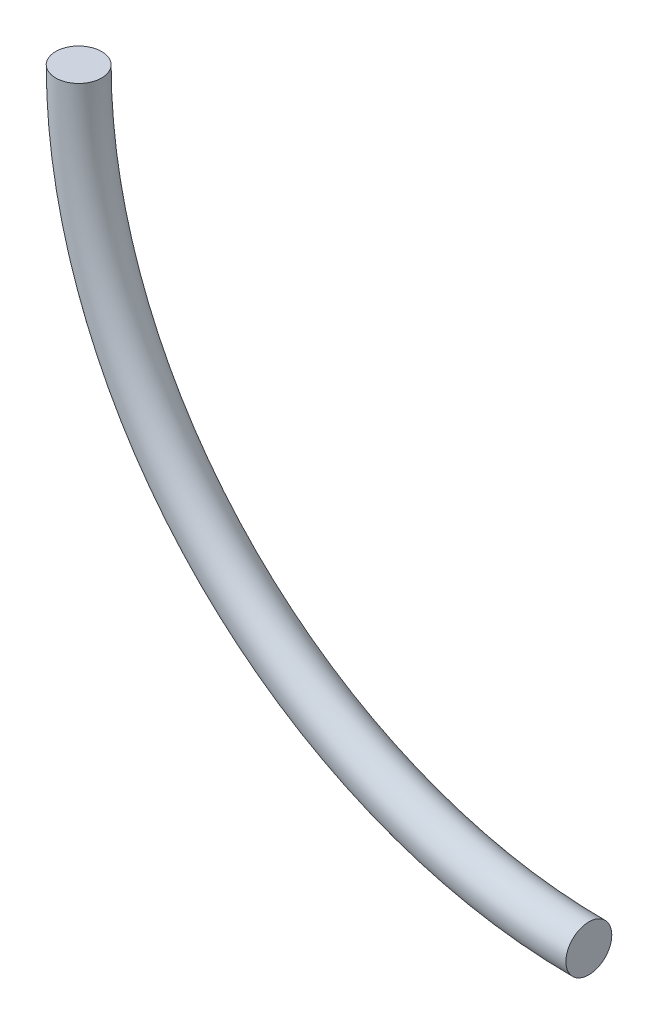
ISO-10303-21;
HEADER;
FILE_DESCRIPTION(('STEP AP214'),'2;1');
FILE_NAME('part.step','',(''),(''),'','','');
FILE_SCHEMA(('AUTOMOTIVE_DESIGN { 1 0 10303 214 1 1 1 1 }'));
ENDSEC;
DATA;
#1=APPLICATION_CONTEXT('core data for automotive mechanical design processes');
#2=APPLICATION_PROTOCOL_DEFINITION('international standard','automotive_design',2000,#1);
#3=PRODUCT_CONTEXT('',#1,'mechanical');
#4=PRODUCT('Part','Part','',(#3));
#5=PRODUCT_RELATED_PRODUCT_CATEGORY('part','',(#4));
#6=PRODUCT_DEFINITION_FORMATION('','',#4);
#7=PRODUCT_DEFINITION_CONTEXT('part definition',#1,'design');
#8=PRODUCT_DEFINITION('design','',#6,#7);
#9=PRODUCT_DEFINITION_SHAPE('','',#8);
#10=(LENGTH_UNIT() NAMED_UNIT(*) SI_UNIT(.MILLI.,.METRE.));
#11=(NAMED_UNIT(*) PLANE_ANGLE_UNIT() SI_UNIT($,.RADIAN.));
#12=(NAMED_UNIT(*) SI_UNIT($,.STERADIAN.) SOLID_ANGLE_UNIT());
#13=UNCERTAINTY_MEASURE_WITH_UNIT(LENGTH_MEASURE(1.E-05),#10,'distance_accuracy_value','');
#14=(GEOMETRIC_REPRESENTATION_CONTEXT(3) GLOBAL_UNCERTAINTY_ASSIGNED_CONTEXT((#13)) GLOBAL_UNIT_ASSIGNED_CONTEXT((#10,
#11,#12)) REPRESENTATION_CONTEXT('',''));
#15=CARTESIAN_POINT('',(0.,0.,0.));
#16=DIRECTION('',(0.,0.,1.));
#17=DIRECTION('',(1.,0.,0.));
#18=AXIS2_PLACEMENT_3D('',#15,#16,#17);
#19=CARTESIAN_POINT('',(50.,0.,0.));
#20=DIRECTION('',(0.,0.,-1.));
#21=DIRECTION('',(-1.,0.,0.));
#22=AXIS2_PLACEMENT_3D('',#19,#20,#21);
#23=TOROIDAL_SURFACE('',#22,50.,2.25);
#24=CARTESIAN_POINT('',(50.,-50.,0.));
#25=DIRECTION('',(-1.,0.,0.));
#26=DIRECTION('',(0.,0.,1.));
#27=AXIS2_PLACEMENT_3D('',#24,#25,#26);
#28=CIRCLE('',#27,2.25);
#29=CARTESIAN_POINT('',(50.,-52.25,0.));
#30=VERTEX_POINT('',#29);
#31=EDGE_CURVE('E10',#30,#30,#28,.T.);
#32=CARTESIAN_POINT('',(0.,0.,0.));
#33=DIRECTION('',(0.,1.,0.));
#34=DIRECTION('',(0.,0.,1.));
#35=AXIS2_PLACEMENT_3D('',#32,#33,#34);
#36=CIRCLE('',#35,2.25);
#37=CARTESIAN_POINT('',(-2.25,0.,0.));
#38=VERTEX_POINT('',#37);
#39=EDGE_CURVE('E39',#38,#38,#36,.T.);
#40=CARTESIAN_POINT('',(50.,0.,0.));
#41=DIRECTION('',(0.,0.,-1.));
#42=DIRECTION('',(-1.,0.,0.));
#43=AXIS2_PLACEMENT_3D('',#40,#41,#42);
#44=CIRCLE('',#43,52.25);
#45=EDGE_CURVE('',#30,#38,#44,.T.);
#46=ORIENTED_EDGE('',*,*,#31,.T.);
#47=ORIENTED_EDGE('',*,*,#39,.F.);
#48=ORIENTED_EDGE('',*,*,#45,.T.);
#49=ORIENTED_EDGE('',*,*,#45,.F.);
#50=EDGE_LOOP('',(#46,#48,#47,#49));
#51=FACE_BOUND('',#50,.T.);
#52=ADVANCED_FACE('F33',(#51),#23,.T.);
#53=CARTESIAN_POINT('',(50.,-50.,0.));
#54=DIRECTION('',(-1.,0.,0.));
#55=DIRECTION('',(0.,0.,1.));
#56=AXIS2_PLACEMENT_3D('',#53,#54,#55);
#57=PLANE('',#56);
#58=ORIENTED_EDGE('',*,*,#31,.F.);
#59=EDGE_LOOP('',(#58));
#60=FACE_BOUND('',#59,.T.);
#61=ADVANCED_FACE('F48',(#60),#57,.F.);
#62=CARTESIAN_POINT('',(0.,0.,0.));
#63=DIRECTION('',(0.,1.,0.));
#64=DIRECTION('',(0.,0.,1.));
#65=AXIS2_PLACEMENT_3D('',#62,#63,#64);
#66=PLANE('',#65);
#67=ORIENTED_EDGE('',*,*,#39,.T.);
#68=EDGE_LOOP('',(#67));
#69=FACE_BOUND('',#68,.T.);
#70=ADVANCED_FACE('F45',(#69),#66,.T.);
#71=CLOSED_SHELL('',(#52,#61,#70));
#72=MANIFOLD_SOLID_BREP('B2',#71);
#73=ADVANCED_BREP_SHAPE_REPRESENTATION('',(#18,#72),#14);
#74=SHAPE_DEFINITION_REPRESENTATION(#9,#73);
ENDSEC;
END-ISO-10303-21;
